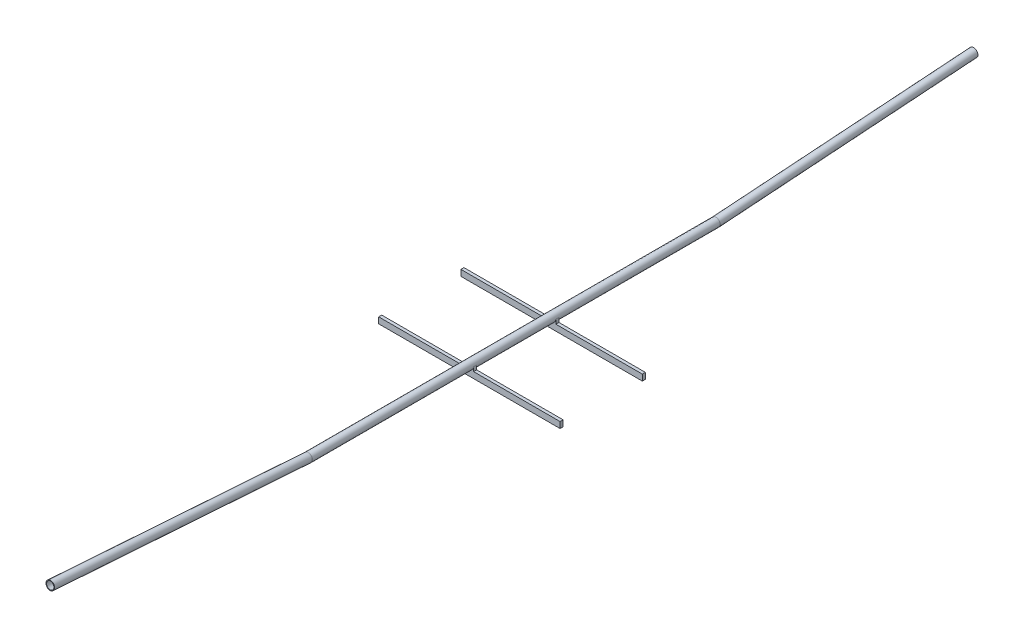
ISO-10303-21;
HEADER;
FILE_DESCRIPTION(('STEP AP214'),'2;1');
FILE_NAME('part.step','',(''),(''),'','','');
FILE_SCHEMA(('AUTOMOTIVE_DESIGN { 1 0 10303 214 1 1 1 1 }'));
ENDSEC;
DATA;
#1=APPLICATION_CONTEXT('core data for automotive mechanical design processes');
#2=APPLICATION_PROTOCOL_DEFINITION('international standard','automotive_design',2000,#1);
#3=PRODUCT_CONTEXT('',#1,'mechanical');
#4=PRODUCT('Part','Part','',(#3));
#5=PRODUCT_RELATED_PRODUCT_CATEGORY('part','',(#4));
#6=PRODUCT_DEFINITION_FORMATION('','',#4);
#7=PRODUCT_DEFINITION_CONTEXT('part definition',#1,'design');
#8=PRODUCT_DEFINITION('design','',#6,#7);
#9=PRODUCT_DEFINITION_SHAPE('','',#8);
#10=(LENGTH_UNIT() NAMED_UNIT(*) SI_UNIT(.MILLI.,.METRE.));
#11=(NAMED_UNIT(*) PLANE_ANGLE_UNIT() SI_UNIT($,.RADIAN.));
#12=(NAMED_UNIT(*) SI_UNIT($,.STERADIAN.) SOLID_ANGLE_UNIT());
#13=UNCERTAINTY_MEASURE_WITH_UNIT(LENGTH_MEASURE(1.E-05),#10,'distance_accuracy_value','');
#14=(GEOMETRIC_REPRESENTATION_CONTEXT(3) GLOBAL_UNCERTAINTY_ASSIGNED_CONTEXT((#13)) GLOBAL_UNIT_ASSIGNED_CONTEXT((#10,
#11,#12)) REPRESENTATION_CONTEXT('',''));
#15=CARTESIAN_POINT('',(0.,0.,0.));
#16=DIRECTION('',(0.,0.,1.));
#17=DIRECTION('',(1.,0.,0.));
#18=AXIS2_PLACEMENT_3D('',#15,#16,#17);
#19=CARTESIAN_POINT('',(0.,0.,-335.28));
#20=DIRECTION('',(0.,0.,1.));
#21=DIRECTION('',(1.,0.,0.));
#22=AXIS2_PLACEMENT_3D('',#19,#20,#21);
#23=CYLINDRICAL_SURFACE('',#22,7.);
#24=CARTESIAN_POINT('',(0.,0.,-335.28));
#25=DIRECTION('',(0.,0.,1.));
#26=DIRECTION('',(1.,0.,0.));
#27=AXIS2_PLACEMENT_3D('',#24,#25,#26);
#28=CIRCLE('',#27,7.);
#29=CARTESIAN_POINT('',(0.,7.,-335.28));
#30=VERTEX_POINT('',#29);
#31=EDGE_CURVE('E11',#30,#30,#28,.T.);
#32=ORIENTED_EDGE('',*,*,#31,.T.);
#33=EDGE_LOOP('',(#32));
#34=FACE_BOUND('',#33,.T.);
#35=CARTESIAN_POINT('',(0.,0.,335.28));
#36=DIRECTION('',(0.,0.,1.));
#37=DIRECTION('',(1.,0.,0.));
#38=AXIS2_PLACEMENT_3D('',#35,#36,#37);
#39=CIRCLE('',#38,7.);
#40=CARTESIAN_POINT('',(0.,7.,335.28));
#41=VERTEX_POINT('',#40);
#42=EDGE_CURVE('E186',#41,#41,#39,.T.);
#43=ORIENTED_EDGE('',*,*,#42,.F.);
#44=EDGE_LOOP('',(#43));
#45=FACE_BOUND('',#44,.T.);
#46=CARTESIAN_POINT('',(0.,0.,-70.13));
#47=DIRECTION('',(0.,0.,1.));
#48=DIRECTION('',(1.,0.,0.));
#49=AXIS2_PLACEMENT_3D('',#46,#47,#48);
#50=CIRCLE('',#49,7.);
#51=CARTESIAN_POINT('',(-7.,0.,-70.13));
#52=VERTEX_POINT('',#51);
#53=CARTESIAN_POINT('',(7.,0.,-70.13));
#54=VERTEX_POINT('',#53);
#55=EDGE_CURVE('E198',#52,#54,#50,.T.);
#56=ORIENTED_EDGE('',*,*,#55,.F.);
#57=DIRECTION('',(0.,0.,1.));
#58=VECTOR('',#57,1.);
#59=CARTESIAN_POINT('',(-7.,0.,-335.28));
#60=LINE('',#59,#58);
#61=CARTESIAN_POINT('',(-7.,0.,-65.13));
#62=VERTEX_POINT('',#61);
#63=EDGE_CURVE('E248',#52,#62,#60,.T.);
#64=ORIENTED_EDGE('',*,*,#63,.T.);
#65=CARTESIAN_POINT('',(0.,0.,-65.13));
#66=DIRECTION('',(0.,0.,-1.));
#67=DIRECTION('',(-1.,0.,0.));
#68=AXIS2_PLACEMENT_3D('',#65,#66,#67);
#69=CIRCLE('',#68,7.);
#70=CARTESIAN_POINT('',(7.,0.,-65.13));
#71=VERTEX_POINT('',#70);
#72=EDGE_CURVE('E190',#71,#62,#69,.T.);
#73=ORIENTED_EDGE('',*,*,#72,.F.);
#74=DIRECTION('',(0.,0.,1.));
#75=VECTOR('',#74,1.);
#76=CARTESIAN_POINT('',(6.99999999999996,0.,-335.28));
#77=LINE('',#76,#75);
#78=EDGE_CURVE('E208',#54,#71,#77,.T.);
#79=ORIENTED_EDGE('',*,*,#78,.F.);
#80=EDGE_LOOP('',(#56,#64,#73,#79));
#81=FACE_BOUND('',#80,.T.);
#82=DIRECTION('',(0.,0.,-1.));
#83=VECTOR('',#82,1.);
#84=CARTESIAN_POINT('',(-7.,0.,335.28));
#85=LINE('',#84,#83);
#86=CARTESIAN_POINT('',(-7.,0.,70.13));
#87=VERTEX_POINT('',#86);
#88=CARTESIAN_POINT('',(-7.,0.,65.13));
#89=VERTEX_POINT('',#88);
#90=EDGE_CURVE('E350',#87,#89,#85,.T.);
#91=ORIENTED_EDGE('',*,*,#90,.F.);
#92=CARTESIAN_POINT('',(0.,0.,70.13));
#93=DIRECTION('',(0.,0.,1.));
#94=DIRECTION('',(1.,0.,0.));
#95=AXIS2_PLACEMENT_3D('',#92,#93,#94);
#96=CIRCLE('',#95,7.);
#97=CARTESIAN_POINT('',(7.00000000000007,0.,70.13));
#98=VERTEX_POINT('',#97);
#99=EDGE_CURVE('E62',#87,#98,#96,.T.);
#100=ORIENTED_EDGE('',*,*,#99,.T.);
#101=DIRECTION('',(0.,0.,-1.));
#102=VECTOR('',#101,1.);
#103=CARTESIAN_POINT('',(6.99999999999996,0.,335.28));
#104=LINE('',#103,#102);
#105=CARTESIAN_POINT('',(7.,0.,65.13));
#106=VERTEX_POINT('',#105);
#107=EDGE_CURVE('E67',#98,#106,#104,.T.);
#108=ORIENTED_EDGE('',*,*,#107,.T.);
#109=CARTESIAN_POINT('',(0.,0.,65.13));
#110=DIRECTION('',(0.,0.,-1.));
#111=DIRECTION('',(-1.,0.,0.));
#112=AXIS2_PLACEMENT_3D('',#109,#110,#111);
#113=CIRCLE('',#112,7.);
#114=EDGE_CURVE('E334',#106,#89,#113,.T.);
#115=ORIENTED_EDGE('',*,*,#114,.T.);
#116=EDGE_LOOP('',(#91,#100,#108,#115));
#117=FACE_BOUND('',#116,.T.);
#118=ADVANCED_FACE('F45',(#34,#45,#81,#117),#23,.T.);
#119=CARTESIAN_POINT('',(0.,-7.,0.));
#120=DIRECTION('',(0.,1.,0.));
#121=DIRECTION('',(0.,0.,1.));
#122=AXIS2_PLACEMENT_3D('',#119,#120,#121);
#123=PLANE('',#122);
#124=DIRECTION('',(1.,0.,0.));
#125=VECTOR('',#124,1.);
#126=CARTESIAN_POINT('',(-149.215,-7.,-65.13));
#127=LINE('',#126,#125);
#128=CARTESIAN_POINT('',(-149.215,-7.,-65.13));
#129=VERTEX_POINT('',#128);
#130=CARTESIAN_POINT('',(-7.,-7.,-65.13));
#131=VERTEX_POINT('',#130);
#132=EDGE_CURVE('E230',#129,#131,#127,.T.);
#133=ORIENTED_EDGE('',*,*,#132,.T.);
#134=DIRECTION('',(0.,0.,1.));
#135=VECTOR('',#134,1.);
#136=CARTESIAN_POINT('',(-7.,-7.,-70.13));
#137=LINE('',#136,#135);
#138=CARTESIAN_POINT('',(-7.00000000000001,-7.,-70.13));
#139=VERTEX_POINT('',#138);
#140=EDGE_CURVE('E270',#139,#131,#137,.T.);
#141=ORIENTED_EDGE('',*,*,#140,.F.);
#142=DIRECTION('',(-1.,0.,0.));
#143=VECTOR('',#142,1.);
#144=CARTESIAN_POINT('',(149.215,-7.,-70.1300000000001));
#145=LINE('',#144,#143);
#146=CARTESIAN_POINT('',(-149.215,-7.,-70.13));
#147=VERTEX_POINT('',#146);
#148=EDGE_CURVE('E243',#139,#147,#145,.T.);
#149=ORIENTED_EDGE('',*,*,#148,.T.);
#150=DIRECTION('',(0.,0.,1.));
#151=VECTOR('',#150,1.);
#152=CARTESIAN_POINT('',(-149.215,-7.,-70.13));
#153=LINE('',#152,#151);
#154=EDGE_CURVE('E236',#147,#129,#153,.T.);
#155=ORIENTED_EDGE('',*,*,#154,.T.);
#156=EDGE_LOOP('',(#133,#141,#149,#155));
#157=FACE_BOUND('',#156,.T.);
#158=ADVANCED_FACE('F399',(#157),#123,.T.);
#159=CARTESIAN_POINT('',(0.,0.,-335.28));
#160=DIRECTION('',(0.,0.,1.));
#161=DIRECTION('',(1.,0.,0.));
#162=AXIS2_PLACEMENT_3D('',#159,#160,#161);
#163=CYLINDRICAL_SURFACE('',#162,6.);
#164=CARTESIAN_POINT('',(0.,0.,-335.28));
#165=DIRECTION('',(0.,0.,1.));
#166=DIRECTION('',(1.,0.,0.));
#167=AXIS2_PLACEMENT_3D('',#164,#165,#166);
#168=CIRCLE('',#167,6.);
#169=CARTESIAN_POINT('',(0.,-6.,-335.28));
#170=VERTEX_POINT('',#169);
#171=EDGE_CURVE('E54',#170,#170,#168,.T.);
#172=ORIENTED_EDGE('',*,*,#171,.F.);
#173=EDGE_LOOP('',(#172));
#174=FACE_BOUND('',#173,.T.);
#175=CARTESIAN_POINT('',(0.,0.,335.28));
#176=DIRECTION('',(0.,0.,-1.));
#177=DIRECTION('',(0.,1.,0.));
#178=AXIS2_PLACEMENT_3D('',#175,#176,#177);
#179=CIRCLE('',#178,6.);
#180=CARTESIAN_POINT('',(0.,-5.99999999999999,335.28));
#181=VERTEX_POINT('',#180);
#182=EDGE_CURVE('E354',#181,#181,#179,.F.);
#183=ORIENTED_EDGE('',*,*,#182,.T.);
#184=EDGE_LOOP('',(#183));
#185=FACE_BOUND('',#184,.T.);
#186=ADVANCED_FACE('F395',(#174,#185),#163,.F.);
#187=CARTESIAN_POINT('',(-7.,7.001,-70.13));
#188=DIRECTION('',(0.,0.,1.));
#189=DIRECTION('',(1.,0.,0.));
#190=AXIS2_PLACEMENT_3D('',#187,#188,#189);
#191=PLANE('',#190);
#192=DIRECTION('',(0.,-1.,0.));
#193=VECTOR('',#192,1.);
#194=CARTESIAN_POINT('',(7.,7.001,-70.13));
#195=LINE('',#194,#193);
#196=CARTESIAN_POINT('',(7.00000000000001,-7.,-70.13));
#197=VERTEX_POINT('',#196);
#198=EDGE_CURVE('E199',#54,#197,#195,.T.);
#199=ORIENTED_EDGE('',*,*,#198,.T.);
#200=CARTESIAN_POINT('',(149.215,-7.,-70.1300000000001));
#201=VERTEX_POINT('',#200);
#202=EDGE_CURVE('E240',#201,#197,#145,.T.);
#203=ORIENTED_EDGE('',*,*,#202,.F.);
#204=DIRECTION('',(0.,1.,0.));
#205=VECTOR('',#204,1.);
#206=CARTESIAN_POINT('',(149.215,-17.,-70.1300000000001));
#207=LINE('',#206,#205);
#208=CARTESIAN_POINT('',(149.215,-17.,-70.1300000000001));
#209=VERTEX_POINT('',#208);
#210=EDGE_CURVE('E216',#209,#201,#207,.T.);
#211=ORIENTED_EDGE('',*,*,#210,.F.);
#212=DIRECTION('',(-1.,0.,0.));
#213=VECTOR('',#212,1.);
#214=CARTESIAN_POINT('',(149.215,-17.,-70.1300000000001));
#215=LINE('',#214,#213);
#216=CARTESIAN_POINT('',(-149.215,-17.,-70.13));
#217=VERTEX_POINT('',#216);
#218=EDGE_CURVE('E256',#209,#217,#215,.T.);
#219=ORIENTED_EDGE('',*,*,#218,.T.);
#220=DIRECTION('',(0.,1.,0.));
#221=VECTOR('',#220,1.);
#222=CARTESIAN_POINT('',(-149.215,-17.,-70.13));
#223=LINE('',#222,#221);
#224=EDGE_CURVE('E219',#217,#147,#223,.T.);
#225=ORIENTED_EDGE('',*,*,#224,.T.);
#226=ORIENTED_EDGE('',*,*,#148,.F.);
#227=DIRECTION('',(0.,-1.,0.));
#228=VECTOR('',#227,1.);
#229=CARTESIAN_POINT('',(-7.,7.001,-70.13));
#230=LINE('',#229,#228);
#231=EDGE_CURVE('E266',#52,#139,#230,.T.);
#232=ORIENTED_EDGE('',*,*,#231,.F.);
#233=ORIENTED_EDGE('',*,*,#55,.T.);
#234=EDGE_LOOP('',(#199,#203,#211,#219,#225,#226,#232,#233));
#235=FACE_BOUND('',#234,.T.);
#236=ADVANCED_FACE('F398',(#235),#191,.F.);
#237=CARTESIAN_POINT('',(7.,7.001,-70.13));
#238=DIRECTION('',(-1.,0.,0.));
#239=DIRECTION('',(0.,0.,1.));
#240=AXIS2_PLACEMENT_3D('',#237,#238,#239);
#241=PLANE('',#240);
#242=ORIENTED_EDGE('',*,*,#198,.F.);
#243=ORIENTED_EDGE('',*,*,#78,.T.);
#244=DIRECTION('',(0.,-1.,0.));
#245=VECTOR('',#244,1.);
#246=CARTESIAN_POINT('',(7.,7.001,-65.13));
#247=LINE('',#246,#245);
#248=CARTESIAN_POINT('',(7.,-7.,-65.13));
#249=VERTEX_POINT('',#248);
#250=EDGE_CURVE('E194',#71,#249,#247,.T.);
#251=ORIENTED_EDGE('',*,*,#250,.T.);
#252=DIRECTION('',(0.,0.,-1.));
#253=VECTOR('',#252,1.);
#254=CARTESIAN_POINT('',(7.,-7.,-70.13));
#255=LINE('',#254,#253);
#256=EDGE_CURVE('E203',#249,#197,#255,.T.);
#257=ORIENTED_EDGE('',*,*,#256,.T.);
#258=EDGE_LOOP('',(#242,#243,#251,#257));
#259=FACE_BOUND('',#258,.T.);
#260=ADVANCED_FACE('F445',(#259),#241,.F.);
#261=CARTESIAN_POINT('',(-7.,7.001,-65.13));
#262=DIRECTION('',(0.,0.,-1.));
#263=DIRECTION('',(-1.,0.,0.));
#264=AXIS2_PLACEMENT_3D('',#261,#262,#263);
#265=PLANE('',#264);
#266=ORIENTED_EDGE('',*,*,#250,.F.);
#267=ORIENTED_EDGE('',*,*,#72,.T.);
#268=DIRECTION('',(0.,-1.,0.));
#269=VECTOR('',#268,1.);
#270=CARTESIAN_POINT('',(-7.,7.001,-65.13));
#271=LINE('',#270,#269);
#272=EDGE_CURVE('E263',#62,#131,#271,.T.);
#273=ORIENTED_EDGE('',*,*,#272,.T.);
#274=ORIENTED_EDGE('',*,*,#132,.F.);
#275=DIRECTION('',(0.,1.,0.));
#276=VECTOR('',#275,1.);
#277=CARTESIAN_POINT('',(-149.215,-17.,-65.13));
#278=LINE('',#277,#276);
#279=CARTESIAN_POINT('',(-149.215,-17.,-65.13));
#280=VERTEX_POINT('',#279);
#281=EDGE_CURVE('E224',#280,#129,#278,.T.);
#282=ORIENTED_EDGE('',*,*,#281,.F.);
#283=DIRECTION('',(1.,0.,0.));
#284=VECTOR('',#283,1.);
#285=CARTESIAN_POINT('',(-149.215,-17.,-65.13));
#286=LINE('',#285,#284);
#287=CARTESIAN_POINT('',(149.215,-17.,-65.1300000000001));
#288=VERTEX_POINT('',#287);
#289=EDGE_CURVE('E220',#280,#288,#286,.T.);
#290=ORIENTED_EDGE('',*,*,#289,.T.);
#291=DIRECTION('',(0.,1.,0.));
#292=VECTOR('',#291,1.);
#293=CARTESIAN_POINT('',(149.215,-17.,-65.1300000000001));
#294=LINE('',#293,#292);
#295=CARTESIAN_POINT('',(149.215,-7.,-65.1300000000001));
#296=VERTEX_POINT('',#295);
#297=EDGE_CURVE('E207',#288,#296,#294,.T.);
#298=ORIENTED_EDGE('',*,*,#297,.T.);
#299=EDGE_CURVE('E235',#249,#296,#127,.T.);
#300=ORIENTED_EDGE('',*,*,#299,.F.);
#301=EDGE_LOOP('',(#266,#267,#273,#274,#282,#290,#298,#300));
#302=FACE_BOUND('',#301,.T.);
#303=ADVANCED_FACE('F436',(#302),#265,.F.);
#304=ORIENTED_EDGE('',*,*,#256,.F.);
#305=ORIENTED_EDGE('',*,*,#299,.T.);
#306=DIRECTION('',(0.,0.,-1.));
#307=VECTOR('',#306,1.);
#308=CARTESIAN_POINT('',(149.215,-7.,-65.1300000000001));
#309=LINE('',#308,#307);
#310=EDGE_CURVE('E244',#296,#201,#309,.T.);
#311=ORIENTED_EDGE('',*,*,#310,.T.);
#312=ORIENTED_EDGE('',*,*,#202,.T.);
#313=EDGE_LOOP('',(#304,#305,#311,#312));
#314=FACE_BOUND('',#313,.T.);
#315=ADVANCED_FACE('F429',(#314),#123,.T.);
#316=CARTESIAN_POINT('',(149.215,-17.,-65.1300000000001));
#317=DIRECTION('',(1.,0.,0.));
#318=DIRECTION('',(0.,0.,-1.));
#319=AXIS2_PLACEMENT_3D('',#316,#317,#318);
#320=PLANE('',#319);
#321=ORIENTED_EDGE('',*,*,#310,.F.);
#322=ORIENTED_EDGE('',*,*,#297,.F.);
#323=DIRECTION('',(0.,0.,-1.));
#324=VECTOR('',#323,1.);
#325=CARTESIAN_POINT('',(149.215,-17.,-65.1300000000001));
#326=LINE('',#325,#324);
#327=EDGE_CURVE('E234',#288,#209,#326,.T.);
#328=ORIENTED_EDGE('',*,*,#327,.T.);
#329=ORIENTED_EDGE('',*,*,#210,.T.);
#330=EDGE_LOOP('',(#321,#322,#328,#329));
#331=FACE_BOUND('',#330,.T.);
#332=ADVANCED_FACE('F435',(#331),#320,.T.);
#333=CARTESIAN_POINT('',(-149.215,-17.,-70.13));
#334=DIRECTION('',(-1.,0.,0.));
#335=DIRECTION('',(0.,0.,1.));
#336=AXIS2_PLACEMENT_3D('',#333,#334,#335);
#337=PLANE('',#336);
#338=ORIENTED_EDGE('',*,*,#154,.F.);
#339=ORIENTED_EDGE('',*,*,#224,.F.);
#340=DIRECTION('',(0.,0.,1.));
#341=VECTOR('',#340,1.);
#342=CARTESIAN_POINT('',(-149.215,-17.,-70.13));
#343=LINE('',#342,#341);
#344=EDGE_CURVE('E252',#217,#280,#343,.T.);
#345=ORIENTED_EDGE('',*,*,#344,.T.);
#346=ORIENTED_EDGE('',*,*,#281,.T.);
#347=EDGE_LOOP('',(#338,#339,#345,#346));
#348=FACE_BOUND('',#347,.T.);
#349=ADVANCED_FACE('F442',(#348),#337,.T.);
#350=CARTESIAN_POINT('',(0.,-17.,0.));
#351=DIRECTION('',(0.,1.,0.));
#352=DIRECTION('',(0.,0.,1.));
#353=AXIS2_PLACEMENT_3D('',#350,#351,#352);
#354=PLANE('',#353);
#355=ORIENTED_EDGE('',*,*,#327,.F.);
#356=ORIENTED_EDGE('',*,*,#289,.F.);
#357=ORIENTED_EDGE('',*,*,#344,.F.);
#358=ORIENTED_EDGE('',*,*,#218,.F.);
#359=EDGE_LOOP('',(#355,#356,#357,#358));
#360=FACE_BOUND('',#359,.T.);
#361=ADVANCED_FACE('F470',(#360),#354,.F.);
#362=CARTESIAN_POINT('',(-7.,7.001,-70.13));
#363=DIRECTION('',(1.,0.,0.));
#364=DIRECTION('',(0.,0.,-1.));
#365=AXIS2_PLACEMENT_3D('',#362,#363,#364);
#366=PLANE('',#365);
#367=ORIENTED_EDGE('',*,*,#63,.F.);
#368=ORIENTED_EDGE('',*,*,#231,.T.);
#369=ORIENTED_EDGE('',*,*,#140,.T.);
#370=ORIENTED_EDGE('',*,*,#272,.F.);
#371=EDGE_LOOP('',(#367,#368,#369,#370));
#372=FACE_BOUND('',#371,.T.);
#373=ADVANCED_FACE('F459',(#372),#366,.F.);
#374=CARTESIAN_POINT('',(0.,-7.,0.));
#375=DIRECTION('',(0.,1.,0.));
#376=DIRECTION('',(0.,0.,-1.));
#377=AXIS2_PLACEMENT_3D('',#374,#375,#376);
#378=PLANE('',#377);
#379=DIRECTION('',(0.,0.,1.));
#380=VECTOR('',#379,1.);
#381=CARTESIAN_POINT('',(7.,-7.,70.13));
#382=LINE('',#381,#380);
#383=CARTESIAN_POINT('',(7.,-7.,65.13));
#384=VERTEX_POINT('',#383);
#385=CARTESIAN_POINT('',(7.00000000000001,-7.,70.13));
#386=VERTEX_POINT('',#385);
#387=EDGE_CURVE('E310',#384,#386,#382,.T.);
#388=ORIENTED_EDGE('',*,*,#387,.T.);
#389=DIRECTION('',(-1.,0.,0.));
#390=VECTOR('',#389,1.);
#391=CARTESIAN_POINT('',(149.215,-7.,70.1300000000001));
#392=LINE('',#391,#390);
#393=CARTESIAN_POINT('',(149.215,-7.,70.1300000000001));
#394=VERTEX_POINT('',#393);
#395=EDGE_CURVE('E306',#394,#386,#392,.T.);
#396=ORIENTED_EDGE('',*,*,#395,.F.);
#397=DIRECTION('',(0.,0.,1.));
#398=VECTOR('',#397,1.);
#399=CARTESIAN_POINT('',(149.215,-7.,65.1300000000001));
#400=LINE('',#399,#398);
#401=CARTESIAN_POINT('',(149.215,-7.,65.1300000000001));
#402=VERTEX_POINT('',#401);
#403=EDGE_CURVE('E267',#402,#394,#400,.T.);
#404=ORIENTED_EDGE('',*,*,#403,.F.);
#405=DIRECTION('',(1.,0.,0.));
#406=VECTOR('',#405,1.);
#407=CARTESIAN_POINT('',(-149.215,-7.,65.13));
#408=LINE('',#407,#406);
#409=EDGE_CURVE('E319',#384,#402,#408,.T.);
#410=ORIENTED_EDGE('',*,*,#409,.F.);
#411=EDGE_LOOP('',(#388,#396,#404,#410));
#412=FACE_BOUND('',#411,.T.);
#413=ADVANCED_FACE('F487',(#412),#378,.T.);
#414=CARTESIAN_POINT('',(149.215,-17.,65.1300000000001));
#415=DIRECTION('',(1.,0.,0.));
#416=DIRECTION('',(0.,0.,1.));
#417=AXIS2_PLACEMENT_3D('',#414,#415,#416);
#418=PLANE('',#417);
#419=ORIENTED_EDGE('',*,*,#403,.T.);
#420=DIRECTION('',(0.,1.,0.));
#421=VECTOR('',#420,1.);
#422=CARTESIAN_POINT('',(149.215,-17.,70.1300000000001));
#423=LINE('',#422,#421);
#424=CARTESIAN_POINT('',(149.215,-17.,70.1300000000001));
#425=VERTEX_POINT('',#424);
#426=EDGE_CURVE('E303',#425,#394,#423,.T.);
#427=ORIENTED_EDGE('',*,*,#426,.F.);
#428=DIRECTION('',(0.,0.,1.));
#429=VECTOR('',#428,1.);
#430=CARTESIAN_POINT('',(149.215,-17.,65.1300000000001));
#431=LINE('',#430,#429);
#432=CARTESIAN_POINT('',(149.215,-17.,65.1300000000001));
#433=VERTEX_POINT('',#432);
#434=EDGE_CURVE('E280',#433,#425,#431,.T.);
#435=ORIENTED_EDGE('',*,*,#434,.F.);
#436=DIRECTION('',(0.,1.,0.));
#437=VECTOR('',#436,1.);
#438=CARTESIAN_POINT('',(149.215,-17.,65.1300000000001));
#439=LINE('',#438,#437);
#440=EDGE_CURVE('E320',#433,#402,#439,.T.);
#441=ORIENTED_EDGE('',*,*,#440,.T.);
#442=EDGE_LOOP('',(#419,#427,#435,#441));
#443=FACE_BOUND('',#442,.T.);
#444=ADVANCED_FACE('F490',(#443),#418,.T.);
#445=CARTESIAN_POINT('',(0.,-17.,0.));
#446=DIRECTION('',(0.,1.,0.));
#447=DIRECTION('',(0.,0.,-1.));
#448=AXIS2_PLACEMENT_3D('',#445,#446,#447);
#449=PLANE('',#448);
#450=ORIENTED_EDGE('',*,*,#434,.T.);
#451=DIRECTION('',(-1.,0.,0.));
#452=VECTOR('',#451,1.);
#453=CARTESIAN_POINT('',(149.215,-17.,70.1300000000001));
#454=LINE('',#453,#452);
#455=CARTESIAN_POINT('',(-149.215,-17.,70.13));
#456=VERTEX_POINT('',#455);
#457=EDGE_CURVE('E299',#425,#456,#454,.T.);
#458=ORIENTED_EDGE('',*,*,#457,.T.);
#459=DIRECTION('',(0.,0.,-1.));
#460=VECTOR('',#459,1.);
#461=CARTESIAN_POINT('',(-149.215,-17.,70.13));
#462=LINE('',#461,#460);
#463=CARTESIAN_POINT('',(-149.215,-17.,65.13));
#464=VERTEX_POINT('',#463);
#465=EDGE_CURVE('E284',#456,#464,#462,.T.);
#466=ORIENTED_EDGE('',*,*,#465,.T.);
#467=DIRECTION('',(1.,0.,0.));
#468=VECTOR('',#467,1.);
#469=CARTESIAN_POINT('',(-149.215,-17.,65.13));
#470=LINE('',#469,#468);
#471=EDGE_CURVE('E323',#464,#433,#470,.T.);
#472=ORIENTED_EDGE('',*,*,#471,.T.);
#473=EDGE_LOOP('',(#450,#458,#466,#472));
#474=FACE_BOUND('',#473,.T.);
#475=ADVANCED_FACE('F492',(#474),#449,.F.);
#476=CARTESIAN_POINT('',(-149.215,-17.,70.13));
#477=DIRECTION('',(-1.,0.,0.));
#478=DIRECTION('',(0.,0.,-1.));
#479=AXIS2_PLACEMENT_3D('',#476,#477,#478);
#480=PLANE('',#479);
#481=DIRECTION('',(0.,0.,-1.));
#482=VECTOR('',#481,1.);
#483=CARTESIAN_POINT('',(-149.215,-7.,70.13));
#484=LINE('',#483,#482);
#485=CARTESIAN_POINT('',(-149.215,-7.,70.13));
#486=VERTEX_POINT('',#485);
#487=CARTESIAN_POINT('',(-149.215,-7.,65.13));
#488=VERTEX_POINT('',#487);
#489=EDGE_CURVE('E288',#486,#488,#484,.T.);
#490=ORIENTED_EDGE('',*,*,#489,.T.);
#491=DIRECTION('',(0.,1.,0.));
#492=VECTOR('',#491,1.);
#493=CARTESIAN_POINT('',(-149.215,-17.,65.13));
#494=LINE('',#493,#492);
#495=EDGE_CURVE('E326',#464,#488,#494,.T.);
#496=ORIENTED_EDGE('',*,*,#495,.F.);
#497=ORIENTED_EDGE('',*,*,#465,.F.);
#498=DIRECTION('',(0.,1.,0.));
#499=VECTOR('',#498,1.);
#500=CARTESIAN_POINT('',(-149.215,-17.,70.13));
#501=LINE('',#500,#499);
#502=EDGE_CURVE('E295',#456,#486,#501,.T.);
#503=ORIENTED_EDGE('',*,*,#502,.T.);
#504=EDGE_LOOP('',(#490,#496,#497,#503));
#505=FACE_BOUND('',#504,.T.);
#506=ADVANCED_FACE('F497',(#505),#480,.T.);
#507=CARTESIAN_POINT('',(-7.,-7.,65.13));
#508=VERTEX_POINT('',#507);
#509=EDGE_CURVE('E330',#488,#508,#408,.T.);
#510=ORIENTED_EDGE('',*,*,#509,.F.);
#511=ORIENTED_EDGE('',*,*,#489,.F.);
#512=CARTESIAN_POINT('',(-7.00000000000001,-7.,70.13));
#513=VERTEX_POINT('',#512);
#514=EDGE_CURVE('E294',#513,#486,#392,.T.);
#515=ORIENTED_EDGE('',*,*,#514,.F.);
#516=DIRECTION('',(0.,0.,-1.));
#517=VECTOR('',#516,1.);
#518=CARTESIAN_POINT('',(-7.,-7.,70.13));
#519=LINE('',#518,#517);
#520=EDGE_CURVE('E343',#513,#508,#519,.T.);
#521=ORIENTED_EDGE('',*,*,#520,.T.);
#522=EDGE_LOOP('',(#510,#511,#515,#521));
#523=FACE_BOUND('',#522,.T.);
#524=ADVANCED_FACE('F500',(#523),#378,.T.);
#525=CARTESIAN_POINT('',(-7.,7.001,70.13));
#526=DIRECTION('',(0.,0.,-1.));
#527=DIRECTION('',(1.,0.,0.));
#528=AXIS2_PLACEMENT_3D('',#525,#526,#527);
#529=PLANE('',#528);
#530=DIRECTION('',(0.,-1.,0.));
#531=VECTOR('',#530,1.);
#532=CARTESIAN_POINT('',(7.,7.001,70.13));
#533=LINE('',#532,#531);
#534=EDGE_CURVE('E316',#98,#386,#533,.T.);
#535=ORIENTED_EDGE('',*,*,#534,.F.);
#536=ORIENTED_EDGE('',*,*,#99,.F.);
#537=DIRECTION('',(0.,-1.,0.));
#538=VECTOR('',#537,1.);
#539=CARTESIAN_POINT('',(-7.,7.001,70.13));
#540=LINE('',#539,#538);
#541=EDGE_CURVE('E347',#87,#513,#540,.T.);
#542=ORIENTED_EDGE('',*,*,#541,.T.);
#543=ORIENTED_EDGE('',*,*,#514,.T.);
#544=ORIENTED_EDGE('',*,*,#502,.F.);
#545=ORIENTED_EDGE('',*,*,#457,.F.);
#546=ORIENTED_EDGE('',*,*,#426,.T.);
#547=ORIENTED_EDGE('',*,*,#395,.T.);
#548=EDGE_LOOP('',(#535,#536,#542,#543,#544,#545,#546,#547));
#549=FACE_BOUND('',#548,.T.);
#550=ADVANCED_FACE('F504',(#549),#529,.F.);
#551=CARTESIAN_POINT('',(7.,7.001,70.13));
#552=DIRECTION('',(-1.,0.,0.));
#553=DIRECTION('',(0.,0.,-1.));
#554=AXIS2_PLACEMENT_3D('',#551,#552,#553);
#555=PLANE('',#554);
#556=ORIENTED_EDGE('',*,*,#534,.T.);
#557=ORIENTED_EDGE('',*,*,#387,.F.);
#558=DIRECTION('',(0.,-1.,0.));
#559=VECTOR('',#558,1.);
#560=CARTESIAN_POINT('',(7.,7.001,65.13));
#561=LINE('',#560,#559);
#562=EDGE_CURVE('E337',#106,#384,#561,.T.);
#563=ORIENTED_EDGE('',*,*,#562,.F.);
#564=ORIENTED_EDGE('',*,*,#107,.F.);
#565=EDGE_LOOP('',(#556,#557,#563,#564));
#566=FACE_BOUND('',#565,.T.);
#567=ADVANCED_FACE('F506',(#566),#555,.F.);
#568=CARTESIAN_POINT('',(-7.,7.001,65.13));
#569=DIRECTION('',(0.,0.,1.));
#570=DIRECTION('',(-1.,0.,0.));
#571=AXIS2_PLACEMENT_3D('',#568,#569,#570);
#572=PLANE('',#571);
#573=ORIENTED_EDGE('',*,*,#562,.T.);
#574=ORIENTED_EDGE('',*,*,#409,.T.);
#575=ORIENTED_EDGE('',*,*,#440,.F.);
#576=ORIENTED_EDGE('',*,*,#471,.F.);
#577=ORIENTED_EDGE('',*,*,#495,.T.);
#578=ORIENTED_EDGE('',*,*,#509,.T.);
#579=DIRECTION('',(0.,-1.,0.));
#580=VECTOR('',#579,1.);
#581=CARTESIAN_POINT('',(-7.,7.001,65.13));
#582=LINE('',#581,#580);
#583=EDGE_CURVE('E340',#89,#508,#582,.T.);
#584=ORIENTED_EDGE('',*,*,#583,.F.);
#585=ORIENTED_EDGE('',*,*,#114,.F.);
#586=EDGE_LOOP('',(#573,#574,#575,#576,#577,#578,#584,#585));
#587=FACE_BOUND('',#586,.T.);
#588=ADVANCED_FACE('F420',(#587),#572,.F.);
#589=CARTESIAN_POINT('',(-7.,7.001,70.13));
#590=DIRECTION('',(1.,0.,0.));
#591=DIRECTION('',(0.,0.,1.));
#592=AXIS2_PLACEMENT_3D('',#589,#590,#591);
#593=PLANE('',#592);
#594=ORIENTED_EDGE('',*,*,#90,.T.);
#595=ORIENTED_EDGE('',*,*,#583,.T.);
#596=ORIENTED_EDGE('',*,*,#520,.F.);
#597=ORIENTED_EDGE('',*,*,#541,.F.);
#598=EDGE_LOOP('',(#594,#595,#596,#597));
#599=FACE_BOUND('',#598,.T.);
#600=ADVANCED_FACE('F408',(#599),#593,.F.);
#601=CARTESIAN_POINT('',(0.,7.,342.28));
#602=DIRECTION('',(0.,-1.,0.));
#603=DIRECTION('',(0.,0.,1.));
#604=AXIS2_PLACEMENT_3D('',#601,#602,#603);
#605=CIRCLE('',#604,7.);
#606=TRIMMED_CURVE('',#605,(PARAMETER_VALUE(-3.14159262378747)),
(PARAMETER_VALUE(3.14159262378747)),.T.,.PARAMETER.);
#607=CARTESIAN_POINT('',(0.,7.,335.28));
#608=DIRECTION('',(-1.,0.,0.));
#609=AXIS1_PLACEMENT('',#607,#608);
#610=SURFACE_OF_REVOLUTION('',#606,#609);
#611=CARTESIAN_POINT('',(0.,0.0170516481812295,335.768295316209));
#612=DIRECTION('',(0.,-0.0697564737441251,-0.997564050259824));
#613=DIRECTION('',(0.,0.997564050259824,-0.0697564737441251));
#614=AXIS2_PLACEMENT_3D('',#611,#612,#613);
#615=CIRCLE('',#614,7.);
#616=EDGE_CURVE('E358',#41,#41,#615,.T.);
#617=ORIENTED_EDGE('',*,*,#616,.T.);
#618=ORIENTED_EDGE('',*,*,#42,.T.);
#619=EDGE_LOOP('',(#617,#618));
#620=FACE_BOUND('',#619,.T.);
#621=ADVANCED_FACE('F405',(#620),#610,.T.);
#622=CARTESIAN_POINT('',(0.,7.,335.28));
#623=DIRECTION('',(-1.,0.,0.));
#624=DIRECTION('',(0.,0.,1.));
#625=AXIS2_PLACEMENT_3D('',#622,#623,#624);
#626=TOROIDAL_SURFACE('',#625,6.99999999999999,6.);
#627=CARTESIAN_POINT('',(0.,0.01705164818123,335.768295316209));
#628=DIRECTION('',(0.,-0.0697564737441251,-0.997564050259824));
#629=DIRECTION('',(0.,0.997564050259824,-0.0697564737441251));
#630=AXIS2_PLACEMENT_3D('',#627,#628,#629);
#631=CIRCLE('',#630,6.);
#632=CARTESIAN_POINT('',(0.,-5.96833265337771,336.186834158674));
#633=VERTEX_POINT('',#632);
#634=EDGE_CURVE('E364',#633,#633,#631,.T.);
#635=CARTESIAN_POINT('',(0.,7.,335.28));
#636=DIRECTION('',(-1.,0.,0.));
#637=DIRECTION('',(0.,0.,1.));
#638=AXIS2_PLACEMENT_3D('',#635,#636,#637);
#639=CIRCLE('',#638,13.);
#640=EDGE_CURVE('',#181,#633,#639,.T.);
#641=ORIENTED_EDGE('',*,*,#182,.F.);
#642=ORIENTED_EDGE('',*,*,#634,.F.);
#643=ORIENTED_EDGE('',*,*,#640,.T.);
#644=ORIENTED_EDGE('',*,*,#640,.F.);
#645=EDGE_LOOP('',(#641,#643,#642,#644));
#646=FACE_BOUND('',#645,.T.);
#647=ADVANCED_FACE('F402',(#646),#626,.F.);
#648=CARTESIAN_POINT('',(0.,0.0170516481812287,335.768295316209));
#649=DIRECTION('',(0.,-0.0697564737441251,-0.997564050259824));
#650=DIRECTION('',(0.,0.997564050259824,-0.0697564737441251));
#651=AXIS2_PLACEMENT_3D('',#648,#649,#650);
#652=CYLINDRICAL_SURFACE('',#651,7.);
#653=CARTESIAN_POINT('',(0.,29.6537870831102,759.593357709598));
#654=DIRECTION('',(0.,-0.0697564737441251,-0.997564050259824));
#655=DIRECTION('',(0.,0.997564050259824,-0.0697564737441251));
#656=AXIS2_PLACEMENT_3D('',#653,#654,#655);
#657=CIRCLE('',#656,7.);
#658=CARTESIAN_POINT('',(0.,36.636735434929,759.105062393389));
#659=VERTEX_POINT('',#658);
#660=EDGE_CURVE('E176',#659,#659,#657,.T.);
#661=ORIENTED_EDGE('',*,*,#660,.T.);
#662=EDGE_LOOP('',(#661));
#663=FACE_BOUND('',#662,.T.);
#664=ORIENTED_EDGE('',*,*,#616,.F.);
#665=EDGE_LOOP('',(#664));
#666=FACE_BOUND('',#665,.T.);
#667=ADVANCED_FACE('F404',(#663,#666),#652,.T.);
#668=CARTESIAN_POINT('',(0.,0.0170516481812287,335.768295316209));
#669=DIRECTION('',(0.,-0.0697564737441251,-0.997564050259824));
#670=DIRECTION('',(0.,0.997564050259824,-0.0697564737441251));
#671=AXIS2_PLACEMENT_3D('',#668,#669,#670);
#672=CYLINDRICAL_SURFACE('',#671,6.);
#673=ORIENTED_EDGE('',*,*,#634,.T.);
#674=EDGE_LOOP('',(#673));
#675=FACE_BOUND('',#674,.T.);
#676=CARTESIAN_POINT('',(0.,29.6537870831102,759.593357709598));
#677=DIRECTION('',(0.,-0.0697564737441251,-0.997564050259824));
#678=DIRECTION('',(0.,0.997564050259824,-0.0697564737441251));
#679=AXIS2_PLACEMENT_3D('',#676,#677,#678);
#680=CIRCLE('',#679,6.00000000000001);
#681=CARTESIAN_POINT('',(0.,35.6391713846692,759.174818867133));
#682=VERTEX_POINT('',#681);
#683=EDGE_CURVE('E368',#682,#682,#680,.T.);
#684=ORIENTED_EDGE('',*,*,#683,.F.);
#685=EDGE_LOOP('',(#684));
#686=FACE_BOUND('',#685,.T.);
#687=ADVANCED_FACE('F413',(#675,#686),#672,.F.);
#688=CARTESIAN_POINT('',(0.,35.6391713846692,759.174818867133));
#689=DIRECTION('',(0.,0.0697564737441251,0.997564050259824));
#690=DIRECTION('',(0.,-0.997564050259824,0.0697564737441251));
#691=AXIS2_PLACEMENT_3D('',#688,#689,#690);
#692=PLANE('',#691);
#693=ORIENTED_EDGE('',*,*,#683,.T.);
#694=EDGE_LOOP('',(#693));
#695=FACE_BOUND('',#694,.T.);
#696=ORIENTED_EDGE('',*,*,#660,.F.);
#697=EDGE_LOOP('',(#696));
#698=FACE_BOUND('',#697,.T.);
#699=ADVANCED_FACE('F392',(#695,#698),#692,.T.);
#700=CARTESIAN_POINT('',(0.,7.00000000000008,-335.28));
#701=DIRECTION('',(1.,0.,0.));
#702=DIRECTION('',(0.,0.,-1.));
#703=AXIS2_PLACEMENT_3D('',#700,#701,#702);
#704=TOROIDAL_SURFACE('',#703,7.00000000000008,7.);
#705=CARTESIAN_POINT('',(0.,0.017051648181228,-335.768295316209));
#706=DIRECTION('',(0.,0.0697564737441227,-0.997564050259825));
#707=DIRECTION('',(-1.,0.,0.));
#708=AXIS2_PLACEMENT_3D('',#705,#706,#707);
#709=CIRCLE('',#708,7.);
#710=EDGE_CURVE('E168',#30,#30,#709,.T.);
#711=ORIENTED_EDGE('',*,*,#710,.F.);
#712=ORIENTED_EDGE('',*,*,#31,.F.);
#713=EDGE_LOOP('',(#711,#712));
#714=FACE_BOUND('',#713,.T.);
#715=ADVANCED_FACE('F166',(#714),#704,.T.);
#716=CARTESIAN_POINT('',(0.,7.00000000000008,-335.28));
#717=DIRECTION('',(1.,0.,0.));
#718=DIRECTION('',(0.,0.,-1.));
#719=AXIS2_PLACEMENT_3D('',#716,#717,#718);
#720=TOROIDAL_SURFACE('',#719,7.00000000000008,6.);
#721=CARTESIAN_POINT('',(0.,0.017051648181228,-335.768295316209));
#722=DIRECTION('',(0.,0.0697564737441227,-0.997564050259825));
#723=DIRECTION('',(-1.,0.,0.));
#724=AXIS2_PLACEMENT_3D('',#721,#722,#723);
#725=CIRCLE('',#724,6.);
#726=CARTESIAN_POINT('',(0.,-5.96833265337771,-336.186834158674));
#727=VERTEX_POINT('',#726);
#728=EDGE_CURVE('E171',#727,#727,#725,.F.);
#729=CARTESIAN_POINT('',(0.,7.00000000000008,-335.28));
#730=DIRECTION('',(1.,0.,0.));
#731=DIRECTION('',(0.,0.,-1.));
#732=AXIS2_PLACEMENT_3D('',#729,#730,#731);
#733=CIRCLE('',#732,13.0000000000001);
#734=EDGE_CURVE('',#170,#727,#733,.T.);
#735=ORIENTED_EDGE('',*,*,#171,.T.);
#736=ORIENTED_EDGE('',*,*,#728,.F.);
#737=ORIENTED_EDGE('',*,*,#734,.T.);
#738=ORIENTED_EDGE('',*,*,#734,.F.);
#739=EDGE_LOOP('',(#735,#737,#736,#738));
#740=FACE_BOUND('',#739,.T.);
#741=ADVANCED_FACE('F387',(#740),#720,.F.);
#742=CARTESIAN_POINT('',(0.,0.0170516481812341,-335.768295316209));
#743=DIRECTION('',(0.,-0.069756473744126,0.997564050259824));
#744=DIRECTION('',(0.,-0.997564050259824,-0.069756473744126));
#745=AXIS2_PLACEMENT_3D('',#742,#743,#744);
#746=CYLINDRICAL_SURFACE('',#745,7.00000000000008);
#747=ORIENTED_EDGE('',*,*,#710,.T.);
#748=EDGE_LOOP('',(#747));
#749=FACE_BOUND('',#748,.T.);
#750=CARTESIAN_POINT('',(0.,29.6537870831106,-759.593357709598));
#751=DIRECTION('',(0.,-0.069756473744126,0.997564050259824));
#752=DIRECTION('',(0.,-0.997564050259824,-0.069756473744126));
#753=AXIS2_PLACEMENT_3D('',#750,#751,#752);
#754=CIRCLE('',#753,7.00000000000016);
#755=CARTESIAN_POINT('',(0.,22.6708387312917,-760.081653025807));
#756=VERTEX_POINT('',#755);
#757=EDGE_CURVE('E172',#756,#756,#754,.T.);
#758=ORIENTED_EDGE('',*,*,#757,.T.);
#759=EDGE_LOOP('',(#758));
#760=FACE_BOUND('',#759,.T.);
#761=ADVANCED_FACE('F390',(#749,#760),#746,.T.);
#762=CARTESIAN_POINT('',(0.,36.6367354349295,-759.105062393389));
#763=DIRECTION('',(0.,-0.069756473744126,0.997564050259824));
#764=DIRECTION('',(0.,-0.997564050259824,-0.069756473744126));
#765=AXIS2_PLACEMENT_3D('',#762,#763,#764);
#766=PLANE('',#765);
#767=ORIENTED_EDGE('',*,*,#757,.F.);
#768=EDGE_LOOP('',(#767));
#769=FACE_BOUND('',#768,.T.);
#770=CARTESIAN_POINT('',(0.,29.6537870831106,-759.593357709598));
#771=DIRECTION('',(0.,-0.069756473744126,0.997564050259824));
#772=DIRECTION('',(0.,-0.997564050259824,-0.069756473744126));
#773=AXIS2_PLACEMENT_3D('',#770,#771,#772);
#774=CIRCLE('',#773,6.00000000000017);
#775=CARTESIAN_POINT('',(0.,23.6684027815515,-760.011896552063));
#776=VERTEX_POINT('',#775);
#777=EDGE_CURVE('E179',#776,#776,#774,.T.);
#778=ORIENTED_EDGE('',*,*,#777,.T.);
#779=EDGE_LOOP('',(#778));
#780=FACE_BOUND('',#779,.T.);
#781=ADVANCED_FACE('F379',(#769,#780),#766,.F.);
#782=CARTESIAN_POINT('',(0.,0.0170516481812341,-335.768295316209));
#783=DIRECTION('',(0.,-0.069756473744126,0.997564050259824));
#784=DIRECTION('',(0.,-0.997564050259824,-0.069756473744126));
#785=AXIS2_PLACEMENT_3D('',#782,#783,#784);
#786=CYLINDRICAL_SURFACE('',#785,6.00000000000008);
#787=ORIENTED_EDGE('',*,*,#777,.F.);
#788=EDGE_LOOP('',(#787));
#789=FACE_BOUND('',#788,.T.);
#790=ORIENTED_EDGE('',*,*,#728,.T.);
#791=EDGE_LOOP('',(#790));
#792=FACE_BOUND('',#791,.T.);
#793=ADVANCED_FACE('F381',(#789,#792),#786,.F.);
#794=CLOSED_SHELL('',(#118,#158,#186,#236,#260,#303,#315,#332,#349,#361,#373,#413,#444,#475,
#506,#524,#550,#567,#588,#600,#621,#647,#667,#687,#699,#715,#741,#761,#781,#793));
#795=MANIFOLD_SOLID_BREP('B2',#794);
#796=ADVANCED_BREP_SHAPE_REPRESENTATION('',(#18,#795),#14);
#797=SHAPE_DEFINITION_REPRESENTATION(#9,#796);
ENDSEC;
END-ISO-10303-21;
